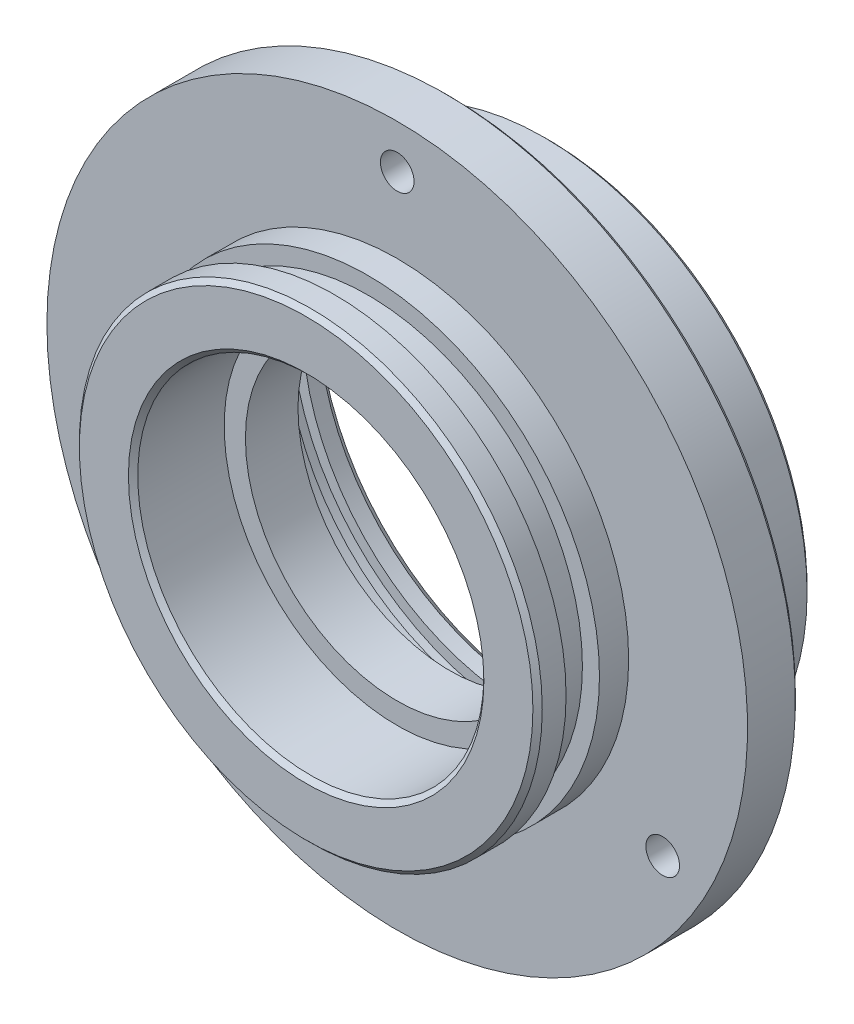
ISO-10303-21;
HEADER;
FILE_DESCRIPTION(('STEP AP214'),'2;1');
FILE_NAME('part.step','',(''),(''),'','','');
FILE_SCHEMA(('AUTOMOTIVE_DESIGN { 1 0 10303 214 1 1 1 1 }'));
ENDSEC;
DATA;
#1=APPLICATION_CONTEXT('core data for automotive mechanical design processes');
#2=APPLICATION_PROTOCOL_DEFINITION('international standard','automotive_design',2000,#1);
#3=PRODUCT_CONTEXT('',#1,'mechanical');
#4=PRODUCT('Part','Part','',(#3));
#5=PRODUCT_RELATED_PRODUCT_CATEGORY('part','',(#4));
#6=PRODUCT_DEFINITION_FORMATION('','',#4);
#7=PRODUCT_DEFINITION_CONTEXT('part definition',#1,'design');
#8=PRODUCT_DEFINITION('design','',#6,#7);
#9=PRODUCT_DEFINITION_SHAPE('','',#8);
#10=(LENGTH_UNIT() NAMED_UNIT(*) SI_UNIT(.MILLI.,.METRE.));
#11=(NAMED_UNIT(*) PLANE_ANGLE_UNIT() SI_UNIT($,.RADIAN.));
#12=(NAMED_UNIT(*) SI_UNIT($,.STERADIAN.) SOLID_ANGLE_UNIT());
#13=UNCERTAINTY_MEASURE_WITH_UNIT(LENGTH_MEASURE(1.E-05),#10,'distance_accuracy_value','');
#14=(GEOMETRIC_REPRESENTATION_CONTEXT(3) GLOBAL_UNCERTAINTY_ASSIGNED_CONTEXT((#13)) GLOBAL_UNIT_ASSIGNED_CONTEXT((#10,
#11,#12)) REPRESENTATION_CONTEXT('',''));
#15=CARTESIAN_POINT('',(0.,0.,0.));
#16=DIRECTION('',(0.,0.,1.));
#17=DIRECTION('',(1.,0.,0.));
#18=AXIS2_PLACEMENT_3D('',#15,#16,#17);
#19=CARTESIAN_POINT('',(0.,24.0665,-15.621));
#20=DIRECTION('',(0.,0.,-1.));
#21=DIRECTION('',(-1.,0.,0.));
#22=AXIS2_PLACEMENT_3D('',#19,#20,#21);
#23=PLANE('',#22);
#24=CARTESIAN_POINT('',(0.,0.,-15.621));
#25=DIRECTION('',(0.,0.,-1.));
#26=DIRECTION('',(-1.,0.,0.));
#27=AXIS2_PLACEMENT_3D('',#24,#25,#26);
#28=CIRCLE('',#27,16.51);
#29=CARTESIAN_POINT('',(-16.51,0.,-15.621));
#30=VERTEX_POINT('',#29);
#31=EDGE_CURVE('E81',#30,#30,#28,.T.);
#32=ORIENTED_EDGE('',*,*,#31,.F.);
#33=EDGE_LOOP('',(#32));
#34=FACE_BOUND('',#33,.T.);
#35=CARTESIAN_POINT('',(0.,0.,-15.621));
#36=DIRECTION('',(0.,0.,1.));
#37=DIRECTION('',(1.,0.,0.));
#38=AXIS2_PLACEMENT_3D('',#35,#36,#37);
#39=CIRCLE('',#38,19.6723);
#40=CARTESIAN_POINT('',(19.6723,0.,-15.621));
#41=VERTEX_POINT('',#40);
#42=EDGE_CURVE('E114',#41,#41,#39,.T.);
#43=ORIENTED_EDGE('',*,*,#42,.F.);
#44=EDGE_LOOP('',(#43));
#45=FACE_BOUND('',#44,.T.);
#46=ADVANCED_FACE('F34',(#34,#45),#23,.T.);
#47=CARTESIAN_POINT('',(0.,0.,-15.621));
#48=DIRECTION('',(0.,0.,-1.));
#49=DIRECTION('',(-1.,0.,0.));
#50=AXIS2_PLACEMENT_3D('',#47,#48,#49);
#51=CIRCLE('',#50,24.0665);
#52=CARTESIAN_POINT('',(-24.0665,0.,-15.621));
#53=VERTEX_POINT('',#52);
#54=EDGE_CURVE('E101',#53,#53,#51,.T.);
#55=ORIENTED_EDGE('',*,*,#54,.T.);
#56=EDGE_LOOP('',(#55));
#57=FACE_BOUND('',#56,.T.);
#58=CARTESIAN_POINT('',(0.,0.,-15.621));
#59=DIRECTION('',(0.,0.,1.));
#60=DIRECTION('',(1.,0.,0.));
#61=AXIS2_PLACEMENT_3D('',#58,#59,#60);
#62=CIRCLE('',#61,23.1775);
#63=CARTESIAN_POINT('',(23.1775,0.,-15.621));
#64=VERTEX_POINT('',#63);
#65=EDGE_CURVE('E117',#64,#64,#62,.T.);
#66=ORIENTED_EDGE('',*,*,#65,.T.);
#67=EDGE_LOOP('',(#66));
#68=FACE_BOUND('',#67,.T.);
#69=ADVANCED_FACE('F183',(#57,#68),#23,.T.);
#70=CARTESIAN_POINT('',(0.,0.,-9.906));
#71=DIRECTION('',(0.,0.,1.));
#72=DIRECTION('',(1.,0.,0.));
#73=AXIS2_PLACEMENT_3D('',#70,#71,#72);
#74=CYLINDRICAL_SURFACE('',#73,25.1714);
#75=CARTESIAN_POINT('',(0.,0.,-0.507999999999998));
#76=DIRECTION('',(0.,0.,1.));
#77=DIRECTION('',(1.,0.,0.));
#78=AXIS2_PLACEMENT_3D('',#75,#76,#77);
#79=CIRCLE('',#78,25.1714);
#80=CARTESIAN_POINT('',(25.1714,0.,-0.507999999999998));
#81=VERTEX_POINT('',#80);
#82=EDGE_CURVE('E45',#81,#81,#79,.F.);
#83=ORIENTED_EDGE('',*,*,#82,.T.);
#84=EDGE_LOOP('',(#83));
#85=FACE_BOUND('',#84,.T.);
#86=CARTESIAN_POINT('',(0.,0.,-3.0988));
#87=DIRECTION('',(0.,0.,1.));
#88=DIRECTION('',(1.,0.,0.));
#89=AXIS2_PLACEMENT_3D('',#86,#87,#88);
#90=CIRCLE('',#89,25.1714);
#91=CARTESIAN_POINT('',(25.1714,0.,-3.0988));
#92=VERTEX_POINT('',#91);
#93=EDGE_CURVE('E91',#92,#92,#90,.T.);
#94=ORIENTED_EDGE('',*,*,#93,.T.);
#95=EDGE_LOOP('',(#94));
#96=FACE_BOUND('',#95,.T.);
#97=ADVANCED_FACE('F189',(#85,#96),#74,.T.);
#98=CARTESIAN_POINT('',(0.,0.,0.));
#99=DIRECTION('',(0.,0.,1.));
#100=DIRECTION('',(1.,0.,0.));
#101=AXIS2_PLACEMENT_3D('',#98,#99,#100);
#102=PLANE('',#101);
#103=CARTESIAN_POINT('',(0.,0.,0.));
#104=DIRECTION('',(0.,0.,1.));
#105=DIRECTION('',(1.,0.,0.));
#106=AXIS2_PLACEMENT_3D('',#103,#104,#105);
#107=CIRCLE('',#106,19.3294);
#108=CARTESIAN_POINT('',(19.3294,0.,0.));
#109=VERTEX_POINT('',#108);
#110=EDGE_CURVE('E57',#109,#109,#107,.F.);
#111=ORIENTED_EDGE('',*,*,#110,.T.);
#112=EDGE_LOOP('',(#111));
#113=FACE_BOUND('',#112,.T.);
#114=CARTESIAN_POINT('',(0.,0.,0.));
#115=DIRECTION('',(0.,0.,1.));
#116=DIRECTION('',(1.,0.,0.));
#117=AXIS2_PLACEMENT_3D('',#114,#115,#116);
#118=CIRCLE('',#117,24.6634);
#119=CARTESIAN_POINT('',(24.6634,0.,0.));
#120=VERTEX_POINT('',#119);
#121=EDGE_CURVE('E60',#120,#120,#118,.T.);
#122=ORIENTED_EDGE('',*,*,#121,.T.);
#123=EDGE_LOOP('',(#122));
#124=FACE_BOUND('',#123,.T.);
#125=ADVANCED_FACE('F226',(#113,#124),#102,.T.);
#126=CARTESIAN_POINT('',(0.,0.,-9.906));
#127=DIRECTION('',(0.,0.,1.));
#128=DIRECTION('',(1.,0.,0.));
#129=AXIS2_PLACEMENT_3D('',#126,#127,#128);
#130=CYLINDRICAL_SURFACE('',#129,18.8214);
#131=CARTESIAN_POINT('',(0.,0.,-0.508000000000005));
#132=DIRECTION('',(0.,0.,1.));
#133=DIRECTION('',(1.,0.,0.));
#134=AXIS2_PLACEMENT_3D('',#131,#132,#133);
#135=CIRCLE('',#134,18.8214);
#136=CARTESIAN_POINT('',(18.8214,0.,-0.508000000000005));
#137=VERTEX_POINT('',#136);
#138=EDGE_CURVE('E63',#137,#137,#135,.T.);
#139=ORIENTED_EDGE('',*,*,#138,.T.);
#140=EDGE_LOOP('',(#139));
#141=FACE_BOUND('',#140,.T.);
#142=CARTESIAN_POINT('',(0.,0.,-9.906));
#143=DIRECTION('',(0.,0.,1.));
#144=DIRECTION('',(1.,0.,0.));
#145=AXIS2_PLACEMENT_3D('',#142,#143,#144);
#146=CIRCLE('',#145,18.8214);
#147=CARTESIAN_POINT('',(18.8214,0.,-9.906));
#148=VERTEX_POINT('',#147);
#149=EDGE_CURVE('E72',#148,#148,#146,.T.);
#150=ORIENTED_EDGE('',*,*,#149,.F.);
#151=EDGE_LOOP('',(#150));
#152=FACE_BOUND('',#151,.T.);
#153=ADVANCED_FACE('F231',(#141,#152),#130,.F.);
#154=CARTESIAN_POINT('',(0.,0.,-9.906));
#155=DIRECTION('',(0.,0.,-1.));
#156=DIRECTION('',(-1.,0.,0.));
#157=AXIS2_PLACEMENT_3D('',#154,#155,#156);
#158=PLANE('',#157);
#159=CARTESIAN_POINT('',(0.,0.,-9.906));
#160=DIRECTION('',(0.,0.,-1.));
#161=DIRECTION('',(-1.,0.,0.));
#162=AXIS2_PLACEMENT_3D('',#159,#160,#161);
#163=CIRCLE('',#162,16.51);
#164=CARTESIAN_POINT('',(-16.51,0.,-9.906));
#165=VERTEX_POINT('',#164);
#166=EDGE_CURVE('E73',#165,#165,#163,.T.);
#167=ORIENTED_EDGE('',*,*,#166,.T.);
#168=EDGE_LOOP('',(#167));
#169=FACE_BOUND('',#168,.T.);
#170=ORIENTED_EDGE('',*,*,#149,.T.);
#171=EDGE_LOOP('',(#170));
#172=FACE_BOUND('',#171,.T.);
#173=ADVANCED_FACE('F177',(#169,#172),#158,.F.);
#174=CARTESIAN_POINT('',(0.,0.,-3.0988));
#175=DIRECTION('',(0.,0.,1.));
#176=DIRECTION('',(1.,0.,0.));
#177=AXIS2_PLACEMENT_3D('',#174,#175,#176);
#178=PLANE('',#177);
#179=ORIENTED_EDGE('',*,*,#93,.F.);
#180=EDGE_LOOP('',(#179));
#181=FACE_BOUND('',#180,.T.);
#182=CARTESIAN_POINT('',(0.,0.,-3.0988));
#183=DIRECTION('',(0.,0.,1.));
#184=DIRECTION('',(1.,0.,0.));
#185=AXIS2_PLACEMENT_3D('',#182,#183,#184);
#186=CIRCLE('',#185,23.3172);
#187=CARTESIAN_POINT('',(23.3172,0.,-3.0988));
#188=VERTEX_POINT('',#187);
#189=EDGE_CURVE('E95',#188,#188,#186,.T.);
#190=ORIENTED_EDGE('',*,*,#189,.T.);
#191=EDGE_LOOP('',(#190));
#192=FACE_BOUND('',#191,.T.);
#193=ADVANCED_FACE('F205',(#181,#192),#178,.F.);
#194=CARTESIAN_POINT('',(0.,0.,-6.731));
#195=DIRECTION('',(0.,0.,1.));
#196=DIRECTION('',(1.,0.,0.));
#197=AXIS2_PLACEMENT_3D('',#194,#195,#196);
#198=PLANE('',#197);
#199=CARTESIAN_POINT('',(0.,0.,-6.731));
#200=DIRECTION('',(0.,0.,1.));
#201=DIRECTION('',(1.,0.,0.));
#202=AXIS2_PLACEMENT_3D('',#199,#200,#201);
#203=CIRCLE('',#202,25.1714);
#204=CARTESIAN_POINT('',(25.1714,0.,-6.731));
#205=VERTEX_POINT('',#204);
#206=EDGE_CURVE('E92',#205,#205,#203,.T.);
#207=ORIENTED_EDGE('',*,*,#206,.T.);
#208=EDGE_LOOP('',(#207));
#209=FACE_BOUND('',#208,.T.);
#210=CARTESIAN_POINT('',(0.,0.,-6.731));
#211=DIRECTION('',(0.,0.,1.));
#212=DIRECTION('',(1.,0.,0.));
#213=AXIS2_PLACEMENT_3D('',#210,#211,#212);
#214=CIRCLE('',#213,23.3172);
#215=CARTESIAN_POINT('',(23.3172,0.,-6.731));
#216=VERTEX_POINT('',#215);
#217=EDGE_CURVE('E98',#216,#216,#214,.T.);
#218=ORIENTED_EDGE('',*,*,#217,.F.);
#219=EDGE_LOOP('',(#218));
#220=FACE_BOUND('',#219,.T.);
#221=ADVANCED_FACE('F178',(#209,#220),#198,.T.);
#222=CARTESIAN_POINT('',(0.,0.,-3.0988));
#223=DIRECTION('',(0.,0.,-1.));
#224=DIRECTION('',(-1.,0.,0.));
#225=AXIS2_PLACEMENT_3D('',#222,#223,#224);
#226=CYLINDRICAL_SURFACE('',#225,23.3172);
#227=ORIENTED_EDGE('',*,*,#189,.F.);
#228=EDGE_LOOP('',(#227));
#229=FACE_BOUND('',#228,.T.);
#230=ORIENTED_EDGE('',*,*,#217,.T.);
#231=EDGE_LOOP('',(#230));
#232=FACE_BOUND('',#231,.T.);
#233=ADVANCED_FACE('F167',(#229,#232),#226,.T.);
#234=CARTESIAN_POINT('',(0.,0.,-14.986));
#235=DIRECTION('',(0.,0.,1.));
#236=DIRECTION('',(1.,0.,0.));
#237=AXIS2_PLACEMENT_3D('',#234,#235,#236);
#238=CYLINDRICAL_SURFACE('',#237,28.575);
#239=CARTESIAN_POINT('',(0.,0.,-25.908));
#240=DIRECTION('',(0.,0.,-1.));
#241=DIRECTION('',(-1.,0.,0.));
#242=AXIS2_PLACEMENT_3D('',#239,#240,#241);
#243=CIRCLE('',#242,28.575);
#244=CARTESIAN_POINT('',(-28.575,0.,-25.908));
#245=VERTEX_POINT('',#244);
#246=EDGE_CURVE('E49',#245,#245,#243,.F.);
#247=ORIENTED_EDGE('',*,*,#246,.T.);
#248=EDGE_LOOP('',(#247));
#249=FACE_BOUND('',#248,.T.);
#250=CARTESIAN_POINT('',(0.,0.,-15.621));
#251=DIRECTION('',(0.,0.,-1.));
#252=DIRECTION('',(-1.,0.,0.));
#253=AXIS2_PLACEMENT_3D('',#250,#251,#252);
#254=CIRCLE('',#253,28.575);
#255=CARTESIAN_POINT('',(-28.575,0.,-15.621));
#256=VERTEX_POINT('',#255);
#257=EDGE_CURVE('E124',#256,#256,#254,.T.);
#258=ORIENTED_EDGE('',*,*,#257,.T.);
#259=EDGE_LOOP('',(#258));
#260=FACE_BOUND('',#259,.T.);
#261=ADVANCED_FACE('F164',(#249,#260),#238,.T.);
#262=CARTESIAN_POINT('',(-28.8711218986639,-16.6687499999997,-9.906));
#263=DIRECTION('',(0.,0.,-1.));
#264=DIRECTION('',(-1.,0.,0.));
#265=AXIS2_PLACEMENT_3D('',#262,#263,#264);
#266=CIRCLE('',#265,1.8288);
#267=CARTESIAN_POINT('',(-30.6999218986639,-16.6687499999997,-9.906));
#268=VERTEX_POINT('',#267);
#269=EDGE_CURVE('E141',#268,#268,#266,.T.);
#270=ORIENTED_EDGE('',*,*,#269,.T.);
#271=EDGE_LOOP('',(#270));
#272=FACE_BOUND('',#271,.T.);
#273=CARTESIAN_POINT('',(28.8711218986637,-16.6687500000001,-9.906));
#274=DIRECTION('',(0.,0.,-1.));
#275=DIRECTION('',(-1.,0.,0.));
#276=AXIS2_PLACEMENT_3D('',#273,#274,#275);
#277=CIRCLE('',#276,1.8288);
#278=CARTESIAN_POINT('',(27.0423218986637,-16.6687500000001,-9.906));
#279=VERTEX_POINT('',#278);
#280=EDGE_CURVE('E135',#279,#279,#277,.T.);
#281=ORIENTED_EDGE('',*,*,#280,.T.);
#282=EDGE_LOOP('',(#281));
#283=FACE_BOUND('',#282,.T.);
#284=CARTESIAN_POINT('',(0.,33.3375,-9.906));
#285=DIRECTION('',(0.,0.,-1.));
#286=DIRECTION('',(-1.,0.,0.));
#287=AXIS2_PLACEMENT_3D('',#284,#285,#286);
#288=CIRCLE('',#287,1.8288);
#289=CARTESIAN_POINT('',(-1.82879999999999,33.3375,-9.906));
#290=VERTEX_POINT('',#289);
#291=EDGE_CURVE('E127',#290,#290,#288,.T.);
#292=ORIENTED_EDGE('',*,*,#291,.T.);
#293=EDGE_LOOP('',(#292));
#294=FACE_BOUND('',#293,.T.);
#295=CARTESIAN_POINT('',(0.,0.,-9.906));
#296=DIRECTION('',(0.,0.,-1.));
#297=DIRECTION('',(-1.,0.,0.));
#298=AXIS2_PLACEMENT_3D('',#295,#296,#297);
#299=CIRCLE('',#298,25.1714);
#300=CARTESIAN_POINT('',(-25.1714,0.,-9.906));
#301=VERTEX_POINT('',#300);
#302=EDGE_CURVE('E88',#301,#301,#299,.F.);
#303=ORIENTED_EDGE('',*,*,#302,.F.);
#304=EDGE_LOOP('',(#303));
#305=FACE_BOUND('',#304,.T.);
#306=CARTESIAN_POINT('',(0.,0.,-9.906));
#307=DIRECTION('',(0.,0.,-1.));
#308=DIRECTION('',(-1.,0.,0.));
#309=AXIS2_PLACEMENT_3D('',#306,#307,#308);
#310=CIRCLE('',#309,38.1);
#311=CARTESIAN_POINT('',(-38.1,0.,-9.906));
#312=VERTEX_POINT('',#311);
#313=EDGE_CURVE('E123',#312,#312,#310,.F.);
#314=ORIENTED_EDGE('',*,*,#313,.T.);
#315=EDGE_LOOP('',(#314));
#316=FACE_BOUND('',#315,.T.);
#317=ADVANCED_FACE('F166',(#272,#283,#294,#305,#316),#158,.F.);
#318=ORIENTED_EDGE('',*,*,#302,.T.);
#319=EDGE_LOOP('',(#318));
#320=FACE_BOUND('',#319,.T.);
#321=ORIENTED_EDGE('',*,*,#206,.F.);
#322=EDGE_LOOP('',(#321));
#323=FACE_BOUND('',#322,.T.);
#324=ADVANCED_FACE('F174',(#320,#323),#74,.T.);
#325=CARTESIAN_POINT('',(0.,28.575,-26.416));
#326=DIRECTION('',(0.,0.,-1.));
#327=DIRECTION('',(-1.,0.,0.));
#328=AXIS2_PLACEMENT_3D('',#325,#326,#327);
#329=PLANE('',#328);
#330=CARTESIAN_POINT('',(0.,0.,-26.416));
#331=DIRECTION('',(0.,0.,-1.));
#332=DIRECTION('',(-1.,0.,0.));
#333=AXIS2_PLACEMENT_3D('',#330,#331,#332);
#334=CIRCLE('',#333,25.0825);
#335=CARTESIAN_POINT('',(-25.0825,0.,-26.416));
#336=VERTEX_POINT('',#335);
#337=EDGE_CURVE('E10',#336,#336,#334,.F.);
#338=ORIENTED_EDGE('',*,*,#337,.T.);
#339=EDGE_LOOP('',(#338));
#340=FACE_BOUND('',#339,.T.);
#341=CARTESIAN_POINT('',(0.,0.,-26.416));
#342=DIRECTION('',(0.,0.,-1.));
#343=DIRECTION('',(-1.,0.,0.));
#344=AXIS2_PLACEMENT_3D('',#341,#342,#343);
#345=CIRCLE('',#344,28.067);
#346=CARTESIAN_POINT('',(-28.067,0.,-26.416));
#347=VERTEX_POINT('',#346);
#348=EDGE_CURVE('E54',#347,#347,#345,.T.);
#349=ORIENTED_EDGE('',*,*,#348,.T.);
#350=EDGE_LOOP('',(#349));
#351=FACE_BOUND('',#350,.T.);
#352=ADVANCED_FACE('F201',(#340,#351),#329,.T.);
#353=CARTESIAN_POINT('',(0.,0.,-23.6328628632659));
#354=DIRECTION('',(0.,0.,-1.));
#355=DIRECTION('',(-1.,0.,0.));
#356=AXIS2_PLACEMENT_3D('',#353,#354,#355);
#357=CYLINDRICAL_SURFACE('',#356,24.0665);
#358=CARTESIAN_POINT('',(0.,0.,-25.4));
#359=DIRECTION('',(0.,0.,-1.));
#360=DIRECTION('',(-1.,0.,0.));
#361=AXIS2_PLACEMENT_3D('',#358,#359,#360);
#362=CIRCLE('',#361,24.0665);
#363=CARTESIAN_POINT('',(-24.0665,0.,-25.4));
#364=VERTEX_POINT('',#363);
#365=EDGE_CURVE('E41',#364,#364,#362,.T.);
#366=ORIENTED_EDGE('',*,*,#365,.T.);
#367=EDGE_LOOP('',(#366));
#368=FACE_BOUND('',#367,.T.);
#369=CARTESIAN_POINT('',(0.,0.,-23.6728));
#370=DIRECTION('',(0.,0.,-1.));
#371=DIRECTION('',(-1.,0.,0.));
#372=AXIS2_PLACEMENT_3D('',#369,#370,#371);
#373=CIRCLE('',#372,24.0665);
#374=CARTESIAN_POINT('',(-24.0665,0.,-23.6728));
#375=VERTEX_POINT('',#374);
#376=EDGE_CURVE('E82',#375,#375,#373,.T.);
#377=ORIENTED_EDGE('',*,*,#376,.F.);
#378=EDGE_LOOP('',(#377));
#379=FACE_BOUND('',#378,.T.);
#380=ADVANCED_FACE('F197',(#368,#379),#357,.F.);
#381=CARTESIAN_POINT('',(0.,25.2603,-21.8948));
#382=DIRECTION('',(0.,0.,1.));
#383=DIRECTION('',(1.,0.,0.));
#384=AXIS2_PLACEMENT_3D('',#381,#382,#383);
#385=PLANE('',#384);
#386=CARTESIAN_POINT('',(0.,0.,-21.8948));
#387=DIRECTION('',(0.,0.,1.));
#388=DIRECTION('',(1.,0.,0.));
#389=AXIS2_PLACEMENT_3D('',#386,#387,#388);
#390=CIRCLE('',#389,24.0665);
#391=CARTESIAN_POINT('',(24.0665,0.,-21.8948));
#392=VERTEX_POINT('',#391);
#393=EDGE_CURVE('E78',#392,#392,#390,.T.);
#394=ORIENTED_EDGE('',*,*,#393,.T.);
#395=EDGE_LOOP('',(#394));
#396=FACE_BOUND('',#395,.T.);
#397=CARTESIAN_POINT('',(0.,0.,-21.8948));
#398=DIRECTION('',(0.,0.,-1.));
#399=DIRECTION('',(-1.,0.,0.));
#400=AXIS2_PLACEMENT_3D('',#397,#398,#399);
#401=CIRCLE('',#400,25.2603);
#402=CARTESIAN_POINT('',(-25.2603,0.,-21.8948));
#403=VERTEX_POINT('',#402);
#404=EDGE_CURVE('E76',#403,#403,#401,.T.);
#405=ORIENTED_EDGE('',*,*,#404,.T.);
#406=EDGE_LOOP('',(#405));
#407=FACE_BOUND('',#406,.T.);
#408=ADVANCED_FACE('F200',(#396,#407),#385,.F.);
#409=CARTESIAN_POINT('',(0.,25.2603,-23.6728));
#410=DIRECTION('',(0.,0.,-1.));
#411=DIRECTION('',(-1.,0.,0.));
#412=AXIS2_PLACEMENT_3D('',#409,#410,#411);
#413=PLANE('',#412);
#414=ORIENTED_EDGE('',*,*,#376,.T.);
#415=EDGE_LOOP('',(#414));
#416=FACE_BOUND('',#415,.T.);
#417=CARTESIAN_POINT('',(0.,0.,-23.6728));
#418=DIRECTION('',(0.,0.,-1.));
#419=DIRECTION('',(-1.,0.,0.));
#420=AXIS2_PLACEMENT_3D('',#417,#418,#419);
#421=CIRCLE('',#420,25.2603);
#422=CARTESIAN_POINT('',(-25.2603,0.,-23.6728));
#423=VERTEX_POINT('',#422);
#424=EDGE_CURVE('E85',#423,#423,#421,.T.);
#425=ORIENTED_EDGE('',*,*,#424,.F.);
#426=EDGE_LOOP('',(#425));
#427=FACE_BOUND('',#426,.T.);
#428=ADVANCED_FACE('F292',(#416,#427),#413,.F.);
#429=CARTESIAN_POINT('',(0.,0.,-23.6328628632659));
#430=DIRECTION('',(0.,0.,-1.));
#431=DIRECTION('',(-1.,0.,0.));
#432=AXIS2_PLACEMENT_3D('',#429,#430,#431);
#433=CYLINDRICAL_SURFACE('',#432,25.2603);
#434=ORIENTED_EDGE('',*,*,#404,.F.);
#435=EDGE_LOOP('',(#434));
#436=FACE_BOUND('',#435,.T.);
#437=ORIENTED_EDGE('',*,*,#424,.T.);
#438=EDGE_LOOP('',(#437));
#439=FACE_BOUND('',#438,.T.);
#440=ADVANCED_FACE('F289',(#436,#439),#433,.F.);
#441=CARTESIAN_POINT('',(0.,0.,-23.6328628632659));
#442=DIRECTION('',(0.,0.,-1.));
#443=DIRECTION('',(-1.,0.,0.));
#444=AXIS2_PLACEMENT_3D('',#441,#442,#443);
#445=CYLINDRICAL_SURFACE('',#444,16.51);
#446=ORIENTED_EDGE('',*,*,#31,.T.);
#447=EDGE_LOOP('',(#446));
#448=FACE_BOUND('',#447,.T.);
#449=ORIENTED_EDGE('',*,*,#166,.F.);
#450=EDGE_LOOP('',(#449));
#451=FACE_BOUND('',#450,.T.);
#452=ADVANCED_FACE('F195',(#448,#451),#445,.F.);
#453=ORIENTED_EDGE('',*,*,#393,.F.);
#454=EDGE_LOOP('',(#453));
#455=FACE_BOUND('',#454,.T.);
#456=ORIENTED_EDGE('',*,*,#54,.F.);
#457=EDGE_LOOP('',(#456));
#458=FACE_BOUND('',#457,.T.);
#459=ADVANCED_FACE('F202',(#455,#458),#357,.F.);
#460=CARTESIAN_POINT('',(0.,23.1775,-13.7414));
#461=DIRECTION('',(0.,0.,-1.));
#462=DIRECTION('',(-1.,0.,0.));
#463=AXIS2_PLACEMENT_3D('',#460,#461,#462);
#464=PLANE('',#463);
#465=CARTESIAN_POINT('',(0.,0.,-13.7414));
#466=DIRECTION('',(0.,0.,1.));
#467=DIRECTION('',(1.,0.,0.));
#468=AXIS2_PLACEMENT_3D('',#465,#466,#467);
#469=CIRCLE('',#468,19.6723);
#470=CARTESIAN_POINT('',(19.6723,0.,-13.7414));
#471=VERTEX_POINT('',#470);
#472=EDGE_CURVE('E77',#471,#471,#469,.T.);
#473=ORIENTED_EDGE('',*,*,#472,.T.);
#474=EDGE_LOOP('',(#473));
#475=FACE_BOUND('',#474,.T.);
#476=CARTESIAN_POINT('',(0.,0.,-13.7414));
#477=DIRECTION('',(0.,0.,1.));
#478=DIRECTION('',(1.,0.,0.));
#479=AXIS2_PLACEMENT_3D('',#476,#477,#478);
#480=CIRCLE('',#479,23.1775);
#481=CARTESIAN_POINT('',(23.1775,0.,-13.7414));
#482=VERTEX_POINT('',#481);
#483=EDGE_CURVE('E120',#482,#482,#480,.T.);
#484=ORIENTED_EDGE('',*,*,#483,.F.);
#485=EDGE_LOOP('',(#484));
#486=FACE_BOUND('',#485,.T.);
#487=ADVANCED_FACE('F284',(#475,#486),#464,.T.);
#488=CARTESIAN_POINT('',(0.,0.,0.));
#489=DIRECTION('',(0.,0.,1.));
#490=DIRECTION('',(1.,0.,0.));
#491=AXIS2_PLACEMENT_3D('',#488,#489,#490);
#492=CYLINDRICAL_SURFACE('',#491,19.6723);
#493=ORIENTED_EDGE('',*,*,#42,.T.);
#494=EDGE_LOOP('',(#493));
#495=FACE_BOUND('',#494,.T.);
#496=ORIENTED_EDGE('',*,*,#472,.F.);
#497=EDGE_LOOP('',(#496));
#498=FACE_BOUND('',#497,.T.);
#499=ADVANCED_FACE('F277',(#495,#498),#492,.T.);
#500=CARTESIAN_POINT('',(0.,0.,0.));
#501=DIRECTION('',(0.,0.,1.));
#502=DIRECTION('',(1.,0.,0.));
#503=AXIS2_PLACEMENT_3D('',#500,#501,#502);
#504=CYLINDRICAL_SURFACE('',#503,23.1775);
#505=ORIENTED_EDGE('',*,*,#483,.T.);
#506=EDGE_LOOP('',(#505));
#507=FACE_BOUND('',#506,.T.);
#508=ORIENTED_EDGE('',*,*,#65,.F.);
#509=EDGE_LOOP('',(#508));
#510=FACE_BOUND('',#509,.T.);
#511=ADVANCED_FACE('F270',(#507,#510),#504,.F.);
#512=CARTESIAN_POINT('',(0.,0.,97.8570734528299));
#513=DIRECTION('',(0.,0.,-1.));
#514=DIRECTION('',(-1.,0.,0.));
#515=AXIS2_PLACEMENT_3D('',#512,#513,#514);
#516=CYLINDRICAL_SURFACE('',#515,38.1);
#517=CARTESIAN_POINT('',(0.,0.,-15.113));
#518=DIRECTION('',(0.,0.,-1.));
#519=DIRECTION('',(-1.,0.,0.));
#520=AXIS2_PLACEMENT_3D('',#517,#518,#519);
#521=CIRCLE('',#520,38.1);
#522=CARTESIAN_POINT('',(-38.1,0.,-15.113));
#523=VERTEX_POINT('',#522);
#524=EDGE_CURVE('E66',#523,#523,#521,.F.);
#525=ORIENTED_EDGE('',*,*,#524,.T.);
#526=EDGE_LOOP('',(#525));
#527=FACE_BOUND('',#526,.T.);
#528=ORIENTED_EDGE('',*,*,#313,.F.);
#529=EDGE_LOOP('',(#528));
#530=FACE_BOUND('',#529,.T.);
#531=ADVANCED_FACE('F155',(#527,#530),#516,.T.);
#532=CARTESIAN_POINT('',(0.,0.,-15.621));
#533=DIRECTION('',(0.,0.,-1.));
#534=DIRECTION('',(-1.,0.,0.));
#535=AXIS2_PLACEMENT_3D('',#532,#533,#534);
#536=PLANE('',#535);
#537=CARTESIAN_POINT('',(0.,0.,-15.621));
#538=DIRECTION('',(0.,0.,-1.));
#539=DIRECTION('',(-1.,0.,0.));
#540=AXIS2_PLACEMENT_3D('',#537,#538,#539);
#541=CIRCLE('',#540,37.592);
#542=CARTESIAN_POINT('',(-37.592,0.,-15.621));
#543=VERTEX_POINT('',#542);
#544=EDGE_CURVE('E69',#543,#543,#541,.T.);
#545=ORIENTED_EDGE('',*,*,#544,.T.);
#546=EDGE_LOOP('',(#545));
#547=FACE_BOUND('',#546,.T.);
#548=CARTESIAN_POINT('',(-28.8711218986639,-16.6687499999997,-15.621));
#549=DIRECTION('',(0.,0.,-1.));
#550=DIRECTION('',(-1.,0.,0.));
#551=AXIS2_PLACEMENT_3D('',#548,#549,#550);
#552=CIRCLE('',#551,1.8288);
#553=CARTESIAN_POINT('',(-30.6999218986639,-16.6687499999997,-15.621));
#554=VERTEX_POINT('',#553);
#555=EDGE_CURVE('E144',#554,#554,#552,.T.);
#556=ORIENTED_EDGE('',*,*,#555,.F.);
#557=EDGE_LOOP('',(#556));
#558=FACE_BOUND('',#557,.T.);
#559=CARTESIAN_POINT('',(28.8711218986637,-16.6687500000001,-15.621));
#560=DIRECTION('',(0.,0.,-1.));
#561=DIRECTION('',(-1.,0.,0.));
#562=AXIS2_PLACEMENT_3D('',#559,#560,#561);
#563=CIRCLE('',#562,1.8288);
#564=CARTESIAN_POINT('',(27.0423218986637,-16.6687500000001,-15.621));
#565=VERTEX_POINT('',#564);
#566=EDGE_CURVE('E138',#565,#565,#563,.T.);
#567=ORIENTED_EDGE('',*,*,#566,.F.);
#568=EDGE_LOOP('',(#567));
#569=FACE_BOUND('',#568,.T.);
#570=CARTESIAN_POINT('',(0.,33.3375,-15.621));
#571=DIRECTION('',(0.,0.,-1.));
#572=DIRECTION('',(-1.,0.,0.));
#573=AXIS2_PLACEMENT_3D('',#570,#571,#572);
#574=CIRCLE('',#573,1.8288);
#575=CARTESIAN_POINT('',(-1.82879999999999,33.3375,-15.621));
#576=VERTEX_POINT('',#575);
#577=EDGE_CURVE('E132',#576,#576,#574,.T.);
#578=ORIENTED_EDGE('',*,*,#577,.F.);
#579=EDGE_LOOP('',(#578));
#580=FACE_BOUND('',#579,.T.);
#581=ORIENTED_EDGE('',*,*,#257,.F.);
#582=EDGE_LOOP('',(#581));
#583=FACE_BOUND('',#582,.T.);
#584=ADVANCED_FACE('F151',(#547,#558,#569,#580,#583),#536,.T.);
#585=CARTESIAN_POINT('',(0.,33.3375,-15.621));
#586=DIRECTION('',(0.,0.,-1.));
#587=DIRECTION('',(-1.,0.,0.));
#588=AXIS2_PLACEMENT_3D('',#585,#586,#587);
#589=CYLINDRICAL_SURFACE('',#588,1.8288);
#590=ORIENTED_EDGE('',*,*,#577,.T.);
#591=EDGE_LOOP('',(#590));
#592=FACE_BOUND('',#591,.T.);
#593=ORIENTED_EDGE('',*,*,#291,.F.);
#594=EDGE_LOOP('',(#593));
#595=FACE_BOUND('',#594,.T.);
#596=ADVANCED_FACE('F154',(#592,#595),#589,.F.);
#597=CARTESIAN_POINT('',(28.8711218986637,-16.6687500000001,-15.621));
#598=DIRECTION('',(0.,0.,-1.));
#599=DIRECTION('',(-1.,0.,0.));
#600=AXIS2_PLACEMENT_3D('',#597,#598,#599);
#601=CYLINDRICAL_SURFACE('',#600,1.8288);
#602=ORIENTED_EDGE('',*,*,#566,.T.);
#603=EDGE_LOOP('',(#602));
#604=FACE_BOUND('',#603,.T.);
#605=ORIENTED_EDGE('',*,*,#280,.F.);
#606=EDGE_LOOP('',(#605));
#607=FACE_BOUND('',#606,.T.);
#608=ADVANCED_FACE('F262',(#604,#607),#601,.F.);
#609=CARTESIAN_POINT('',(-28.8711218986639,-16.6687499999997,-15.621));
#610=DIRECTION('',(0.,0.,-1.));
#611=DIRECTION('',(-1.,0.,0.));
#612=AXIS2_PLACEMENT_3D('',#609,#610,#611);
#613=CYLINDRICAL_SURFACE('',#612,1.8288);
#614=ORIENTED_EDGE('',*,*,#555,.T.);
#615=EDGE_LOOP('',(#614));
#616=FACE_BOUND('',#615,.T.);
#617=ORIENTED_EDGE('',*,*,#269,.F.);
#618=EDGE_LOOP('',(#617));
#619=FACE_BOUND('',#618,.T.);
#620=ADVANCED_FACE('F148',(#616,#619),#613,.F.);
#621=CARTESIAN_POINT('',(0.,0.,-15.621));
#622=DIRECTION('',(0.,0.,1.));
#623=DIRECTION('',(1.,0.,0.));
#624=AXIS2_PLACEMENT_3D('',#621,#622,#623);
#625=CONICAL_SURFACE('',#624,37.592,0.785398163397455);
#626=ORIENTED_EDGE('',*,*,#524,.F.);
#627=EDGE_LOOP('',(#626));
#628=FACE_BOUND('',#627,.T.);
#629=ORIENTED_EDGE('',*,*,#544,.F.);
#630=EDGE_LOOP('',(#629));
#631=FACE_BOUND('',#630,.T.);
#632=ADVANCED_FACE('F255',(#628,#631),#625,.T.);
#633=CARTESIAN_POINT('',(0.,0.,-0.508000000000005));
#634=DIRECTION('',(0.,0.,1.));
#635=DIRECTION('',(1.,0.,0.));
#636=AXIS2_PLACEMENT_3D('',#633,#634,#635);
#637=CONICAL_SURFACE('',#636,18.8214,0.785398163397452);
#638=ORIENTED_EDGE('',*,*,#110,.F.);
#639=EDGE_LOOP('',(#638));
#640=FACE_BOUND('',#639,.T.);
#641=ORIENTED_EDGE('',*,*,#138,.F.);
#642=EDGE_LOOP('',(#641));
#643=FACE_BOUND('',#642,.T.);
#644=ADVANCED_FACE('F250',(#640,#643),#637,.F.);
#645=CARTESIAN_POINT('',(0.,0.,-26.416));
#646=DIRECTION('',(0.,0.,1.));
#647=DIRECTION('',(1.,0.,0.));
#648=AXIS2_PLACEMENT_3D('',#645,#646,#647);
#649=CONICAL_SURFACE('',#648,28.067,0.785398163397438);
#650=ORIENTED_EDGE('',*,*,#246,.F.);
#651=EDGE_LOOP('',(#650));
#652=FACE_BOUND('',#651,.T.);
#653=ORIENTED_EDGE('',*,*,#348,.F.);
#654=EDGE_LOOP('',(#653));
#655=FACE_BOUND('',#654,.T.);
#656=ADVANCED_FACE('F242',(#652,#655),#649,.T.);
#657=CARTESIAN_POINT('',(0.,0.,0.));
#658=DIRECTION('',(0.,0.,-1.));
#659=DIRECTION('',(-1.,0.,0.));
#660=AXIS2_PLACEMENT_3D('',#657,#658,#659);
#661=CONICAL_SURFACE('',#660,24.6634,0.785398163397445);
#662=ORIENTED_EDGE('',*,*,#82,.F.);
#663=EDGE_LOOP('',(#662));
#664=FACE_BOUND('',#663,.T.);
#665=ORIENTED_EDGE('',*,*,#121,.F.);
#666=EDGE_LOOP('',(#665));
#667=FACE_BOUND('',#666,.T.);
#668=ADVANCED_FACE('F239',(#664,#667),#661,.T.);
#669=CARTESIAN_POINT('',(0.,0.,-25.4));
#670=DIRECTION('',(0.,0.,-1.));
#671=DIRECTION('',(-1.,0.,0.));
#672=AXIS2_PLACEMENT_3D('',#669,#670,#671);
#673=CONICAL_SURFACE('',#672,24.0665,0.785398163397448);
#674=ORIENTED_EDGE('',*,*,#337,.F.);
#675=EDGE_LOOP('',(#674));
#676=FACE_BOUND('',#675,.T.);
#677=ORIENTED_EDGE('',*,*,#365,.F.);
#678=EDGE_LOOP('',(#677));
#679=FACE_BOUND('',#678,.T.);
#680=ADVANCED_FACE('F36',(#676,#679),#673,.F.);
#681=CLOSED_SHELL('',(#46,#69,#97,#125,#153,#173,#193,#221,#233,#261,#317,#324,#352,#380,#408,
#428,#440,#452,#459,#487,#499,#511,#531,#584,#596,#608,#620,#632,#644,#656,#668,#680));
#682=MANIFOLD_SOLID_BREP('B2',#681);
#683=ADVANCED_BREP_SHAPE_REPRESENTATION('',(#18,#682),#14);
#684=SHAPE_DEFINITION_REPRESENTATION(#9,#683);
ENDSEC;
END-ISO-10303-21;
